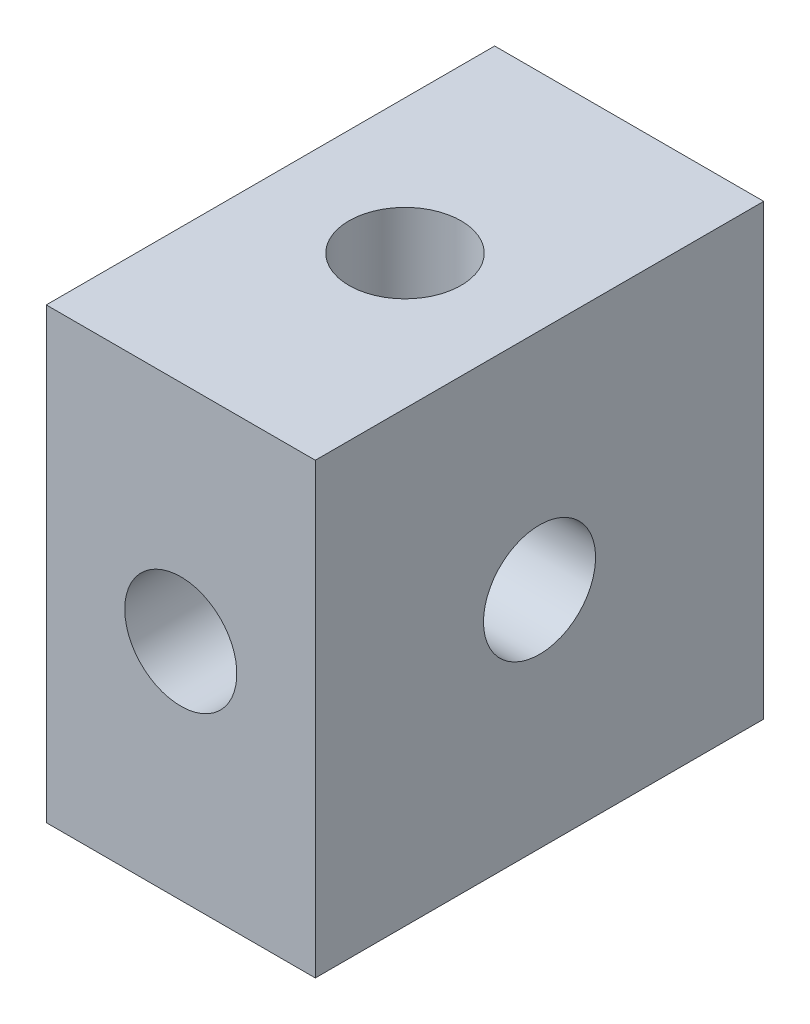
ISO-10303-21;
HEADER;
FILE_DESCRIPTION(('STEP AP214'),'2;1');
FILE_NAME('part.step','',(''),(''),'','','');
FILE_SCHEMA(('AUTOMOTIVE_DESIGN { 1 0 10303 214 1 1 1 1 }'));
ENDSEC;
DATA;
#1=APPLICATION_CONTEXT('core data for automotive mechanical design processes');
#2=APPLICATION_PROTOCOL_DEFINITION('international standard','automotive_design',2000,#1);
#3=PRODUCT_CONTEXT('',#1,'mechanical');
#4=PRODUCT('Part','Part','',(#3));
#5=PRODUCT_RELATED_PRODUCT_CATEGORY('part','',(#4));
#6=PRODUCT_DEFINITION_FORMATION('','',#4);
#7=PRODUCT_DEFINITION_CONTEXT('part definition',#1,'design');
#8=PRODUCT_DEFINITION('design','',#6,#7);
#9=PRODUCT_DEFINITION_SHAPE('','',#8);
#10=(LENGTH_UNIT() NAMED_UNIT(*) SI_UNIT(.MILLI.,.METRE.));
#11=(NAMED_UNIT(*) PLANE_ANGLE_UNIT() SI_UNIT($,.RADIAN.));
#12=(NAMED_UNIT(*) SI_UNIT($,.STERADIAN.) SOLID_ANGLE_UNIT());
#13=UNCERTAINTY_MEASURE_WITH_UNIT(LENGTH_MEASURE(1.E-05),#10,'distance_accuracy_value','');
#14=(GEOMETRIC_REPRESENTATION_CONTEXT(3) GLOBAL_UNCERTAINTY_ASSIGNED_CONTEXT((#13)) GLOBAL_UNIT_ASSIGNED_CONTEXT((#10,
#11,#12)) REPRESENTATION_CONTEXT('',''));
#15=CARTESIAN_POINT('',(0.,0.,0.));
#16=DIRECTION('',(0.,0.,1.));
#17=DIRECTION('',(1.,0.,0.));
#18=AXIS2_PLACEMENT_3D('',#15,#16,#17);
#19=CARTESIAN_POINT('',(0.,-5.,5.));
#20=DIRECTION('',(0.,1.,0.));
#21=DIRECTION('',(-1.,0.,0.));
#22=AXIS2_PLACEMENT_3D('',#19,#20,#21);
#23=CYLINDRICAL_SURFACE('',#22,1.25);
#24=CARTESIAN_POINT('',(0.,5.,5.));
#25=DIRECTION('',(0.,1.,0.));
#26=DIRECTION('',(-1.,0.,0.));
#27=AXIS2_PLACEMENT_3D('',#24,#25,#26);
#28=CIRCLE('',#27,1.25);
#29=CARTESIAN_POINT('',(-1.25,5.,5.));
#30=VERTEX_POINT('',#29);
#31=EDGE_CURVE('E155',#30,#30,#28,.T.);
#32=ORIENTED_EDGE('',*,*,#31,.T.);
#33=EDGE_LOOP('',(#32));
#34=FACE_BOUND('',#33,.T.);
#35=CARTESIAN_POINT('',(0.,0.,5.));
#36=DIRECTION('',(0.,0.707106781186547,0.707106781186547));
#37=DIRECTION('',(0.,0.707106781186547,-0.707106781186547));
#38=AXIS2_PLACEMENT_3D('',#35,#36,#37);
#39=ELLIPSE('',#38,1.76776695296637,1.25);
#40=CARTESIAN_POINT('',(-0.883883476483184,0.883883476483185,4.11611652351682));
#41=VERTEX_POINT('',#40);
#42=CARTESIAN_POINT('',(0.883883476483185,0.883883476483184,4.11611652351682));
#43=VERTEX_POINT('',#42);
#44=EDGE_CURVE('E112',#41,#43,#39,.F.);
#45=ORIENTED_EDGE('',*,*,#44,.T.);
#46=CARTESIAN_POINT('',(0.,0.,5.));
#47=DIRECTION('',(-0.707106781186547,0.707106781186548,0.));
#48=DIRECTION('',(0.707106781186548,0.707106781186547,0.));
#49=AXIS2_PLACEMENT_3D('',#46,#47,#48);
#50=ELLIPSE('',#49,1.76776695296637,1.25);
#51=CARTESIAN_POINT('',(0.883883476483184,0.883883476483184,5.88388347648318));
#52=VERTEX_POINT('',#51);
#53=EDGE_CURVE('E101',#43,#52,#50,.F.);
#54=ORIENTED_EDGE('',*,*,#53,.T.);
#55=CARTESIAN_POINT('',(0.,0.,5.));
#56=DIRECTION('',(0.,0.707106781186547,-0.707106781186547));
#57=DIRECTION('',(0.,0.707106781186547,0.707106781186547));
#58=AXIS2_PLACEMENT_3D('',#55,#56,#57);
#59=ELLIPSE('',#58,1.76776695296637,1.25);
#60=CARTESIAN_POINT('',(-0.883883476483184,0.883883476483184,5.88388347648318));
#61=VERTEX_POINT('',#60);
#62=EDGE_CURVE('E107',#52,#61,#59,.F.);
#63=ORIENTED_EDGE('',*,*,#62,.T.);
#64=CARTESIAN_POINT('',(0.,0.,5.));
#65=DIRECTION('',(0.707106781186548,0.707106781186547,0.));
#66=DIRECTION('',(-0.707106781186547,0.707106781186548,0.));
#67=AXIS2_PLACEMENT_3D('',#64,#65,#66);
#68=ELLIPSE('',#67,1.76776695296637,1.25);
#69=EDGE_CURVE('E53',#61,#41,#68,.F.);
#70=ORIENTED_EDGE('',*,*,#69,.T.);
#71=EDGE_LOOP('',(#45,#54,#63,#70));
#72=FACE_BOUND('',#71,.T.);
#73=ADVANCED_FACE('F38',(#34,#72),#23,.F.);
#74=CARTESIAN_POINT('',(-3.,-5.,10.));
#75=DIRECTION('',(1.,0.,0.));
#76=DIRECTION('',(0.,0.,-1.));
#77=AXIS2_PLACEMENT_3D('',#74,#75,#76);
#78=PLANE('',#77);
#79=CARTESIAN_POINT('',(-3.,0.,5.));
#80=DIRECTION('',(-1.,0.,0.));
#81=DIRECTION('',(0.,0.,1.));
#82=AXIS2_PLACEMENT_3D('',#79,#80,#81);
#83=CIRCLE('',#82,1.25);
#84=CARTESIAN_POINT('',(-3.,0.,6.25));
#85=VERTEX_POINT('',#84);
#86=EDGE_CURVE('E176',#85,#85,#83,.T.);
#87=ORIENTED_EDGE('',*,*,#86,.F.);
#88=EDGE_LOOP('',(#87));
#89=FACE_BOUND('',#88,.T.);
#90=DIRECTION('',(0.,-1.,0.));
#91=VECTOR('',#90,1.);
#92=CARTESIAN_POINT('',(-3.,-5.,0.));
#93=LINE('',#92,#91);
#94=CARTESIAN_POINT('',(-3.,5.,0.));
#95=VERTEX_POINT('',#94);
#96=CARTESIAN_POINT('',(-3.,-5.,0.));
#97=VERTEX_POINT('',#96);
#98=EDGE_CURVE('E144',#95,#97,#93,.T.);
#99=ORIENTED_EDGE('',*,*,#98,.T.);
#100=DIRECTION('',(0.,0.,-1.));
#101=VECTOR('',#100,1.);
#102=CARTESIAN_POINT('',(-3.,-5.,10.));
#103=LINE('',#102,#101);
#104=CARTESIAN_POINT('',(-3.,-5.,10.));
#105=VERTEX_POINT('',#104);
#106=EDGE_CURVE('E124',#105,#97,#103,.T.);
#107=ORIENTED_EDGE('',*,*,#106,.F.);
#108=DIRECTION('',(0.,-1.,0.));
#109=VECTOR('',#108,1.);
#110=CARTESIAN_POINT('',(-3.,-5.,10.));
#111=LINE('',#110,#109);
#112=CARTESIAN_POINT('',(-3.,5.,10.));
#113=VERTEX_POINT('',#112);
#114=EDGE_CURVE('E139',#113,#105,#111,.T.);
#115=ORIENTED_EDGE('',*,*,#114,.F.);
#116=DIRECTION('',(0.,0.,-1.));
#117=VECTOR('',#116,1.);
#118=CARTESIAN_POINT('',(-3.,5.,10.));
#119=LINE('',#118,#117);
#120=EDGE_CURVE('E133',#113,#95,#119,.T.);
#121=ORIENTED_EDGE('',*,*,#120,.T.);
#122=EDGE_LOOP('',(#99,#107,#115,#121));
#123=FACE_BOUND('',#122,.T.);
#124=ADVANCED_FACE('F40',(#89,#123),#78,.F.);
#125=CARTESIAN_POINT('',(3.,-5.,10.));
#126=DIRECTION('',(0.,1.,0.));
#127=DIRECTION('',(0.,0.,1.));
#128=AXIS2_PLACEMENT_3D('',#125,#126,#127);
#129=PLANE('',#128);
#130=CARTESIAN_POINT('',(0.,-5.,5.));
#131=DIRECTION('',(0.,1.,0.));
#132=DIRECTION('',(-1.,0.,0.));
#133=AXIS2_PLACEMENT_3D('',#130,#131,#132);
#134=CIRCLE('',#133,1.25);
#135=CARTESIAN_POINT('',(-1.25,-5.,5.));
#136=VERTEX_POINT('',#135);
#137=EDGE_CURVE('E147',#136,#136,#134,.T.);
#138=ORIENTED_EDGE('',*,*,#137,.T.);
#139=EDGE_LOOP('',(#138));
#140=FACE_BOUND('',#139,.T.);
#141=DIRECTION('',(1.,0.,0.));
#142=VECTOR('',#141,1.);
#143=CARTESIAN_POINT('',(3.,-5.,0.));
#144=LINE('',#143,#142);
#145=CARTESIAN_POINT('',(3.,-5.,0.));
#146=VERTEX_POINT('',#145);
#147=EDGE_CURVE('E142',#97,#146,#144,.T.);
#148=ORIENTED_EDGE('',*,*,#147,.T.);
#149=DIRECTION('',(0.,0.,-1.));
#150=VECTOR('',#149,1.);
#151=CARTESIAN_POINT('',(3.,-5.,10.));
#152=LINE('',#151,#150);
#153=CARTESIAN_POINT('',(3.,-5.,10.));
#154=VERTEX_POINT('',#153);
#155=EDGE_CURVE('E127',#154,#146,#152,.T.);
#156=ORIENTED_EDGE('',*,*,#155,.F.);
#157=DIRECTION('',(1.,0.,0.));
#158=VECTOR('',#157,1.);
#159=CARTESIAN_POINT('',(3.,-5.,10.));
#160=LINE('',#159,#158);
#161=EDGE_CURVE('E151',#105,#154,#160,.T.);
#162=ORIENTED_EDGE('',*,*,#161,.F.);
#163=ORIENTED_EDGE('',*,*,#106,.T.);
#164=EDGE_LOOP('',(#148,#156,#162,#163));
#165=FACE_BOUND('',#164,.T.);
#166=ADVANCED_FACE('F203',(#140,#165),#129,.F.);
#167=CARTESIAN_POINT('',(3.,-5.,10.));
#168=DIRECTION('',(-1.,0.,0.));
#169=DIRECTION('',(0.,0.,1.));
#170=AXIS2_PLACEMENT_3D('',#167,#168,#169);
#171=PLANE('',#170);
#172=CARTESIAN_POINT('',(3.,0.,5.));
#173=DIRECTION('',(-1.,0.,0.));
#174=DIRECTION('',(0.,0.,1.));
#175=AXIS2_PLACEMENT_3D('',#172,#173,#174);
#176=CIRCLE('',#175,1.25);
#177=CARTESIAN_POINT('',(3.,0.,6.25));
#178=VERTEX_POINT('',#177);
#179=EDGE_CURVE('E175',#178,#178,#176,.T.);
#180=ORIENTED_EDGE('',*,*,#179,.T.);
#181=EDGE_LOOP('',(#180));
#182=FACE_BOUND('',#181,.T.);
#183=DIRECTION('',(0.,1.,0.));
#184=VECTOR('',#183,1.);
#185=CARTESIAN_POINT('',(3.,-5.,0.));
#186=LINE('',#185,#184);
#187=CARTESIAN_POINT('',(3.,5.,0.));
#188=VERTEX_POINT('',#187);
#189=EDGE_CURVE('E140',#146,#188,#186,.T.);
#190=ORIENTED_EDGE('',*,*,#189,.T.);
#191=DIRECTION('',(0.,0.,-1.));
#192=VECTOR('',#191,1.);
#193=CARTESIAN_POINT('',(3.,5.,10.));
#194=LINE('',#193,#192);
#195=CARTESIAN_POINT('',(3.,5.,10.));
#196=VERTEX_POINT('',#195);
#197=EDGE_CURVE('E130',#196,#188,#194,.T.);
#198=ORIENTED_EDGE('',*,*,#197,.F.);
#199=DIRECTION('',(0.,1.,0.));
#200=VECTOR('',#199,1.);
#201=CARTESIAN_POINT('',(3.,-5.,10.));
#202=LINE('',#201,#200);
#203=EDGE_CURVE('E149',#154,#196,#202,.T.);
#204=ORIENTED_EDGE('',*,*,#203,.F.);
#205=ORIENTED_EDGE('',*,*,#155,.T.);
#206=EDGE_LOOP('',(#190,#198,#204,#205));
#207=FACE_BOUND('',#206,.T.);
#208=ADVANCED_FACE('F182',(#182,#207),#171,.F.);
#209=CARTESIAN_POINT('',(3.,5.,10.));
#210=DIRECTION('',(0.,-1.,0.));
#211=DIRECTION('',(1.,0.,0.));
#212=AXIS2_PLACEMENT_3D('',#209,#210,#211);
#213=PLANE('',#212);
#214=ORIENTED_EDGE('',*,*,#31,.F.);
#215=EDGE_LOOP('',(#214));
#216=FACE_BOUND('',#215,.T.);
#217=DIRECTION('',(-1.,0.,0.));
#218=VECTOR('',#217,1.);
#219=CARTESIAN_POINT('',(3.,5.,0.));
#220=LINE('',#219,#218);
#221=EDGE_CURVE('E137',#188,#95,#220,.T.);
#222=ORIENTED_EDGE('',*,*,#221,.T.);
#223=ORIENTED_EDGE('',*,*,#120,.F.);
#224=DIRECTION('',(-1.,0.,0.));
#225=VECTOR('',#224,1.);
#226=CARTESIAN_POINT('',(3.,5.,10.));
#227=LINE('',#226,#225);
#228=EDGE_CURVE('E136',#196,#113,#227,.T.);
#229=ORIENTED_EDGE('',*,*,#228,.F.);
#230=ORIENTED_EDGE('',*,*,#197,.T.);
#231=EDGE_LOOP('',(#222,#223,#229,#230));
#232=FACE_BOUND('',#231,.T.);
#233=ADVANCED_FACE('F233',(#216,#232),#213,.F.);
#234=CARTESIAN_POINT('',(0.,0.,10.));
#235=DIRECTION('',(0.,0.,1.));
#236=DIRECTION('',(1.,0.,0.));
#237=AXIS2_PLACEMENT_3D('',#234,#235,#236);
#238=PLANE('',#237);
#239=CARTESIAN_POINT('',(0.,0.,10.));
#240=DIRECTION('',(0.,0.,-1.));
#241=DIRECTION('',(-1.,0.,0.));
#242=AXIS2_PLACEMENT_3D('',#239,#240,#241);
#243=CIRCLE('',#242,1.25);
#244=CARTESIAN_POINT('',(-1.25,0.,10.));
#245=VERTEX_POINT('',#244);
#246=EDGE_CURVE('E158',#245,#245,#243,.T.);
#247=ORIENTED_EDGE('',*,*,#246,.T.);
#248=EDGE_LOOP('',(#247));
#249=FACE_BOUND('',#248,.T.);
#250=ORIENTED_EDGE('',*,*,#114,.T.);
#251=ORIENTED_EDGE('',*,*,#161,.T.);
#252=ORIENTED_EDGE('',*,*,#203,.T.);
#253=ORIENTED_EDGE('',*,*,#228,.T.);
#254=EDGE_LOOP('',(#250,#251,#252,#253));
#255=FACE_BOUND('',#254,.T.);
#256=ADVANCED_FACE('F214',(#249,#255),#238,.T.);
#257=CARTESIAN_POINT('',(0.,0.,0.));
#258=DIRECTION('',(0.,0.,1.));
#259=DIRECTION('',(1.,0.,0.));
#260=AXIS2_PLACEMENT_3D('',#257,#258,#259);
#261=PLANE('',#260);
#262=CARTESIAN_POINT('',(0.,0.,0.));
#263=DIRECTION('',(0.,0.,-1.));
#264=DIRECTION('',(-1.,0.,0.));
#265=AXIS2_PLACEMENT_3D('',#262,#263,#264);
#266=CIRCLE('',#265,1.25);
#267=CARTESIAN_POINT('',(-1.25,0.,0.));
#268=VERTEX_POINT('',#267);
#269=EDGE_CURVE('E161',#268,#268,#266,.T.);
#270=ORIENTED_EDGE('',*,*,#269,.F.);
#271=EDGE_LOOP('',(#270));
#272=FACE_BOUND('',#271,.T.);
#273=ORIENTED_EDGE('',*,*,#98,.F.);
#274=ORIENTED_EDGE('',*,*,#221,.F.);
#275=ORIENTED_EDGE('',*,*,#189,.F.);
#276=ORIENTED_EDGE('',*,*,#147,.F.);
#277=EDGE_LOOP('',(#273,#274,#275,#276));
#278=FACE_BOUND('',#277,.T.);
#279=ADVANCED_FACE('F207',(#272,#278),#261,.F.);
#280=CARTESIAN_POINT('',(0.,0.,5.));
#281=DIRECTION('',(0.,0.707106781186547,-0.707106781186547));
#282=DIRECTION('',(0.,0.707106781186547,0.707106781186547));
#283=AXIS2_PLACEMENT_3D('',#280,#281,#282);
#284=ELLIPSE('',#283,1.76776695296637,1.25);
#285=CARTESIAN_POINT('',(0.883883476483184,-0.883883476483185,4.11611652351682));
#286=VERTEX_POINT('',#285);
#287=CARTESIAN_POINT('',(-0.883883476483185,-0.883883476483184,4.11611652351682));
#288=VERTEX_POINT('',#287);
#289=EDGE_CURVE('E116',#286,#288,#284,.T.);
#290=ORIENTED_EDGE('',*,*,#289,.T.);
#291=CARTESIAN_POINT('',(0.,0.,5.));
#292=DIRECTION('',(-0.707106781186547,0.707106781186548,0.));
#293=DIRECTION('',(0.707106781186548,0.707106781186547,0.));
#294=AXIS2_PLACEMENT_3D('',#291,#292,#293);
#295=ELLIPSE('',#294,1.76776695296637,1.25);
#296=CARTESIAN_POINT('',(-0.883883476483184,-0.883883476483184,5.88388347648318));
#297=VERTEX_POINT('',#296);
#298=EDGE_CURVE('E170',#288,#297,#295,.T.);
#299=ORIENTED_EDGE('',*,*,#298,.T.);
#300=CARTESIAN_POINT('',(0.,0.,5.));
#301=DIRECTION('',(0.,0.707106781186547,0.707106781186547));
#302=DIRECTION('',(0.,0.707106781186547,-0.707106781186547));
#303=AXIS2_PLACEMENT_3D('',#300,#301,#302);
#304=ELLIPSE('',#303,1.76776695296637,1.25);
#305=CARTESIAN_POINT('',(0.883883476483184,-0.883883476483184,5.88388347648318));
#306=VERTEX_POINT('',#305);
#307=EDGE_CURVE('E119',#297,#306,#304,.T.);
#308=ORIENTED_EDGE('',*,*,#307,.T.);
#309=CARTESIAN_POINT('',(0.,0.,5.));
#310=DIRECTION('',(0.707106781186548,0.707106781186547,0.));
#311=DIRECTION('',(-0.707106781186547,0.707106781186548,0.));
#312=AXIS2_PLACEMENT_3D('',#309,#310,#311);
#313=ELLIPSE('',#312,1.76776695296637,1.25);
#314=EDGE_CURVE('E60',#306,#286,#313,.T.);
#315=ORIENTED_EDGE('',*,*,#314,.T.);
#316=EDGE_LOOP('',(#290,#299,#308,#315));
#317=FACE_BOUND('',#316,.T.);
#318=ORIENTED_EDGE('',*,*,#137,.F.);
#319=EDGE_LOOP('',(#318));
#320=FACE_BOUND('',#319,.T.);
#321=ADVANCED_FACE('F199',(#317,#320),#23,.F.);
#322=CARTESIAN_POINT('',(0.,0.,10.));
#323=DIRECTION('',(0.,0.,-1.));
#324=DIRECTION('',(-1.,0.,0.));
#325=AXIS2_PLACEMENT_3D('',#322,#323,#324);
#326=CYLINDRICAL_SURFACE('',#325,1.25);
#327=ORIENTED_EDGE('',*,*,#269,.T.);
#328=EDGE_LOOP('',(#327));
#329=FACE_BOUND('',#328,.T.);
#330=ORIENTED_EDGE('',*,*,#289,.F.);
#331=CARTESIAN_POINT('',(0.,0.,5.));
#332=DIRECTION('',(-0.707106781186547,0.,-0.707106781186547));
#333=DIRECTION('',(0.707106781186547,0.,-0.707106781186547));
#334=AXIS2_PLACEMENT_3D('',#331,#332,#333);
#335=ELLIPSE('',#334,1.76776695296637,1.25);
#336=EDGE_CURVE('E113',#286,#43,#335,.F.);
#337=ORIENTED_EDGE('',*,*,#336,.T.);
#338=ORIENTED_EDGE('',*,*,#44,.F.);
#339=CARTESIAN_POINT('',(0.,0.,5.));
#340=DIRECTION('',(0.707106781186547,0.,-0.707106781186547));
#341=DIRECTION('',(-0.707106781186547,0.,-0.707106781186547));
#342=AXIS2_PLACEMENT_3D('',#339,#340,#341);
#343=ELLIPSE('',#342,1.76776695296637,1.25);
#344=EDGE_CURVE('E164',#41,#288,#343,.F.);
#345=ORIENTED_EDGE('',*,*,#344,.T.);
#346=EDGE_LOOP('',(#330,#337,#338,#345));
#347=FACE_BOUND('',#346,.T.);
#348=ADVANCED_FACE('F193',(#329,#347),#326,.F.);
#349=ORIENTED_EDGE('',*,*,#246,.F.);
#350=EDGE_LOOP('',(#349));
#351=FACE_BOUND('',#350,.T.);
#352=ORIENTED_EDGE('',*,*,#307,.F.);
#353=CARTESIAN_POINT('',(0.,0.,5.));
#354=DIRECTION('',(-0.707106781186547,0.,-0.707106781186547));
#355=DIRECTION('',(0.707106781186547,0.,-0.707106781186547));
#356=AXIS2_PLACEMENT_3D('',#353,#354,#355);
#357=ELLIPSE('',#356,1.76776695296637,1.25);
#358=EDGE_CURVE('E11',#297,#61,#357,.T.);
#359=ORIENTED_EDGE('',*,*,#358,.T.);
#360=ORIENTED_EDGE('',*,*,#62,.F.);
#361=CARTESIAN_POINT('',(0.,0.,5.));
#362=DIRECTION('',(0.707106781186547,0.,-0.707106781186547));
#363=DIRECTION('',(-0.707106781186547,0.,-0.707106781186547));
#364=AXIS2_PLACEMENT_3D('',#361,#362,#363);
#365=ELLIPSE('',#364,1.76776695296637,1.25);
#366=EDGE_CURVE('E46',#52,#306,#365,.T.);
#367=ORIENTED_EDGE('',*,*,#366,.T.);
#368=EDGE_LOOP('',(#352,#359,#360,#367));
#369=FACE_BOUND('',#368,.T.);
#370=ADVANCED_FACE('F115',(#351,#369),#326,.F.);
#371=CARTESIAN_POINT('',(3.,0.,5.));
#372=DIRECTION('',(-1.,0.,0.));
#373=DIRECTION('',(0.,0.,1.));
#374=AXIS2_PLACEMENT_3D('',#371,#372,#373);
#375=CYLINDRICAL_SURFACE('',#374,1.25);
#376=ORIENTED_EDGE('',*,*,#179,.F.);
#377=EDGE_LOOP('',(#376));
#378=FACE_BOUND('',#377,.T.);
#379=ORIENTED_EDGE('',*,*,#314,.F.);
#380=ORIENTED_EDGE('',*,*,#366,.F.);
#381=ORIENTED_EDGE('',*,*,#53,.F.);
#382=ORIENTED_EDGE('',*,*,#336,.F.);
#383=EDGE_LOOP('',(#379,#380,#381,#382));
#384=FACE_BOUND('',#383,.T.);
#385=ADVANCED_FACE('F100',(#378,#384),#375,.F.);
#386=ORIENTED_EDGE('',*,*,#86,.T.);
#387=EDGE_LOOP('',(#386));
#388=FACE_BOUND('',#387,.T.);
#389=ORIENTED_EDGE('',*,*,#69,.F.);
#390=ORIENTED_EDGE('',*,*,#358,.F.);
#391=ORIENTED_EDGE('',*,*,#298,.F.);
#392=ORIENTED_EDGE('',*,*,#344,.F.);
#393=EDGE_LOOP('',(#389,#390,#391,#392));
#394=FACE_BOUND('',#393,.T.);
#395=ADVANCED_FACE('F186',(#388,#394),#375,.F.);
#396=CLOSED_SHELL('',(#73,#124,#166,#208,#233,#256,#279,#321,#348,#370,#385,#395));
#397=MANIFOLD_SOLID_BREP('B2',#396);
#398=ADVANCED_BREP_SHAPE_REPRESENTATION('',(#18,#397),#14);
#399=SHAPE_DEFINITION_REPRESENTATION(#9,#398);
ENDSEC;
END-ISO-10303-21;
